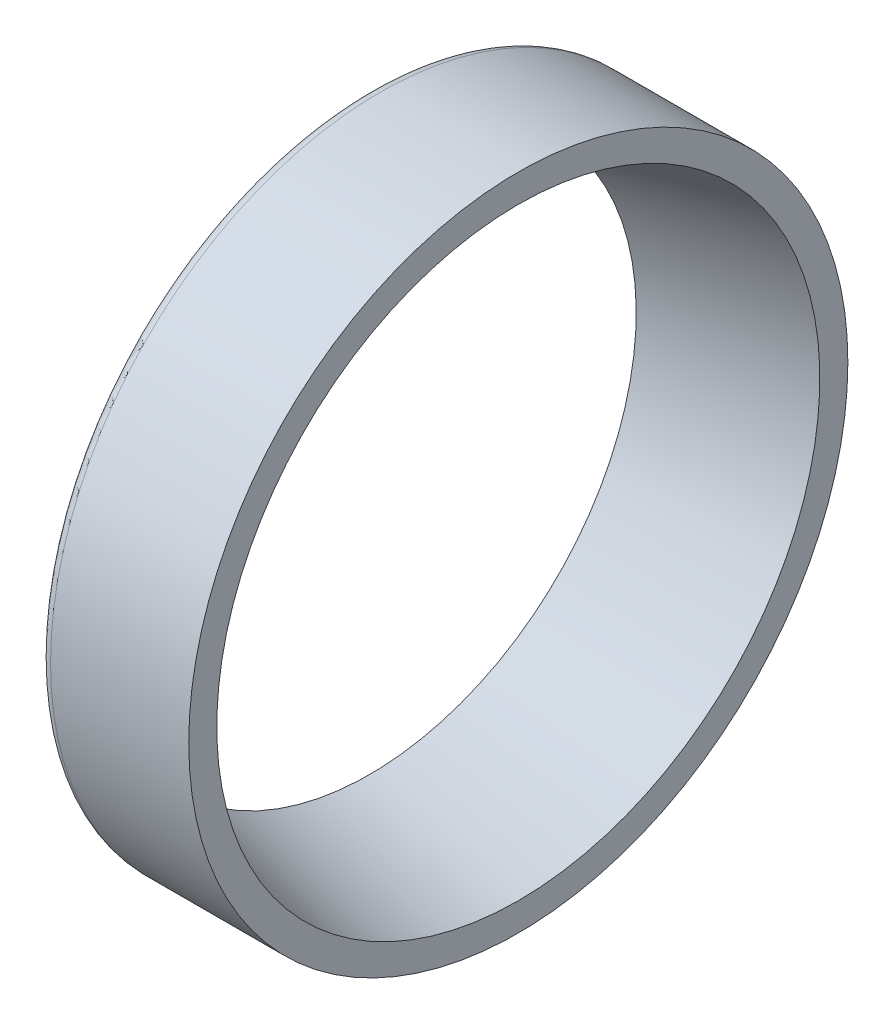
ISO-10303-21;
HEADER;
FILE_DESCRIPTION(('STEP AP214'),'2;1');
FILE_NAME('part.step','',(''),(''),'','','');
FILE_SCHEMA(('AUTOMOTIVE_DESIGN { 1 0 10303 214 1 1 1 1 }'));
ENDSEC;
DATA;
#1=APPLICATION_CONTEXT('core data for automotive mechanical design processes');
#2=APPLICATION_PROTOCOL_DEFINITION('international standard','automotive_design',2000,#1);
#3=PRODUCT_CONTEXT('',#1,'mechanical');
#4=PRODUCT('Part','Part','',(#3));
#5=PRODUCT_RELATED_PRODUCT_CATEGORY('part','',(#4));
#6=PRODUCT_DEFINITION_FORMATION('','',#4);
#7=PRODUCT_DEFINITION_CONTEXT('part definition',#1,'design');
#8=PRODUCT_DEFINITION('design','',#6,#7);
#9=PRODUCT_DEFINITION_SHAPE('','',#8);
#10=(LENGTH_UNIT() NAMED_UNIT(*) SI_UNIT(.MILLI.,.METRE.));
#11=(NAMED_UNIT(*) PLANE_ANGLE_UNIT() SI_UNIT($,.RADIAN.));
#12=(NAMED_UNIT(*) SI_UNIT($,.STERADIAN.) SOLID_ANGLE_UNIT());
#13=UNCERTAINTY_MEASURE_WITH_UNIT(LENGTH_MEASURE(1.E-05),#10,'distance_accuracy_value','');
#14=(GEOMETRIC_REPRESENTATION_CONTEXT(3) GLOBAL_UNCERTAINTY_ASSIGNED_CONTEXT((#13)) GLOBAL_UNIT_ASSIGNED_CONTEXT((#10,
#11,#12)) REPRESENTATION_CONTEXT('',''));
#15=CARTESIAN_POINT('',(0.,0.,0.));
#16=DIRECTION('',(0.,0.,1.));
#17=DIRECTION('',(1.,0.,0.));
#18=AXIS2_PLACEMENT_3D('',#15,#16,#17);
#19=CARTESIAN_POINT('',(0.,0.,27.5460751871387));
#20=DIRECTION('',(-1.,0.,0.));
#21=DIRECTION('',(0.,0.,1.));
#22=AXIS2_PLACEMENT_3D('',#19,#20,#21);
#23=PLANE('',#22);
#24=CARTESIAN_POINT('',(0.,0.,0.));
#25=DIRECTION('',(1.,0.,0.));
#26=DIRECTION('',(0.,1.,0.));
#27=AXIS2_PLACEMENT_3D('',#24,#25,#26);
#28=CIRCLE('',#27,25.0921503742774);
#29=CARTESIAN_POINT('',(0.,25.0921503742774,0.));
#30=VERTEX_POINT('',#29);
#31=EDGE_CURVE('E18',#30,#30,#28,.F.);
#32=ORIENTED_EDGE('',*,*,#31,.F.);
#33=EDGE_LOOP('',(#32));
#34=FACE_BOUND('',#33,.T.);
#35=CARTESIAN_POINT('',(0.,0.,0.));
#36=DIRECTION('',(1.,0.,0.));
#37=DIRECTION('',(0.,0.,1.));
#38=AXIS2_PLACEMENT_3D('',#35,#36,#37);
#39=CIRCLE('',#38,30.);
#40=CARTESIAN_POINT('',(0.,0.,30.));
#41=VERTEX_POINT('',#40);
#42=EDGE_CURVE('E35',#41,#41,#39,.T.);
#43=ORIENTED_EDGE('',*,*,#42,.F.);
#44=EDGE_LOOP('',(#43));
#45=FACE_BOUND('',#44,.T.);
#46=ADVANCED_FACE('F14',(#34,#45),#23,.T.);
#47=CARTESIAN_POINT('',(0.,0.,0.));
#48=DIRECTION('',(1.,0.,0.));
#49=DIRECTION('',(0.,1.,0.));
#50=AXIS2_PLACEMENT_3D('',#47,#48,#49);
#51=CONICAL_SURFACE('',#50,25.0921503742774,0.22957551684018);
#52=ORIENTED_EDGE('',*,*,#31,.T.);
#53=EDGE_LOOP('',(#52));
#54=FACE_BOUND('',#53,.T.);
#55=CARTESIAN_POINT('',(14.,0.,0.));
#56=DIRECTION('',(1.,0.,0.));
#57=DIRECTION('',(0.,1.,0.));
#58=AXIS2_PLACEMENT_3D('',#55,#56,#57);
#59=CIRCLE('',#58,28.3638895047122);
#60=CARTESIAN_POINT('',(14.,28.3638895047122,0.));
#61=VERTEX_POINT('',#60);
#62=EDGE_CURVE('E27',#61,#61,#59,.F.);
#63=ORIENTED_EDGE('',*,*,#62,.F.);
#64=EDGE_LOOP('',(#63));
#65=FACE_BOUND('',#64,.T.);
#66=ADVANCED_FACE('F44',(#54,#65),#51,.F.);
#67=CARTESIAN_POINT('',(1.,0.,0.));
#68=DIRECTION('',(1.,0.,0.));
#69=DIRECTION('',(0.,1.,0.));
#70=AXIS2_PLACEMENT_3D('',#67,#68,#69);
#71=TOROIDAL_SURFACE('',#70,30.,1.);
#72=ORIENTED_EDGE('',*,*,#42,.T.);
#73=EDGE_LOOP('',(#72));
#74=FACE_BOUND('',#73,.T.);
#75=CARTESIAN_POINT('',(1.,0.,0.));
#76=DIRECTION('',(1.,0.,0.));
#77=DIRECTION('',(0.,0.,-1.));
#78=AXIS2_PLACEMENT_3D('',#75,#76,#77);
#79=CIRCLE('',#78,31.);
#80=CARTESIAN_POINT('',(1.,0.,-31.));
#81=VERTEX_POINT('',#80);
#82=EDGE_CURVE('E22',#81,#81,#79,.T.);
#83=ORIENTED_EDGE('',*,*,#82,.F.);
#84=EDGE_LOOP('',(#83));
#85=FACE_BOUND('',#84,.T.);
#86=ADVANCED_FACE('F60',(#74,#85),#71,.T.);
#87=CARTESIAN_POINT('',(14.,0.,29.6819447523561));
#88=DIRECTION('',(1.,0.,0.));
#89=DIRECTION('',(0.,0.,-1.));
#90=AXIS2_PLACEMENT_3D('',#87,#88,#89);
#91=PLANE('',#90);
#92=CARTESIAN_POINT('',(14.,0.,0.));
#93=DIRECTION('',(1.,0.,0.));
#94=DIRECTION('',(0.,0.,-1.));
#95=AXIS2_PLACEMENT_3D('',#92,#93,#94);
#96=CIRCLE('',#95,31.);
#97=CARTESIAN_POINT('',(14.,0.,-31.));
#98=VERTEX_POINT('',#97);
#99=EDGE_CURVE('E10',#98,#98,#96,.F.);
#100=ORIENTED_EDGE('',*,*,#99,.F.);
#101=EDGE_LOOP('',(#100));
#102=FACE_BOUND('',#101,.T.);
#103=ORIENTED_EDGE('',*,*,#62,.T.);
#104=EDGE_LOOP('',(#103));
#105=FACE_BOUND('',#104,.T.);
#106=ADVANCED_FACE('F64',(#102,#105),#91,.T.);
#107=CARTESIAN_POINT('',(7.5,0.,0.));
#108=DIRECTION('',(1.,0.,0.));
#109=DIRECTION('',(0.,0.,-1.));
#110=AXIS2_PLACEMENT_3D('',#107,#108,#109);
#111=CYLINDRICAL_SURFACE('',#110,31.);
#112=ORIENTED_EDGE('',*,*,#82,.T.);
#113=EDGE_LOOP('',(#112));
#114=FACE_BOUND('',#113,.T.);
#115=ORIENTED_EDGE('',*,*,#99,.T.);
#116=EDGE_LOOP('',(#115));
#117=FACE_BOUND('',#116,.T.);
#118=ADVANCED_FACE('F70',(#114,#117),#111,.T.);
#119=CLOSED_SHELL('',(#46,#66,#86,#106,#118));
#120=MANIFOLD_SOLID_BREP('B1',#119);
#121=ADVANCED_BREP_SHAPE_REPRESENTATION('',(#18,#120),#14);
#122=SHAPE_DEFINITION_REPRESENTATION(#9,#121);
ENDSEC;
END-ISO-10303-21;
